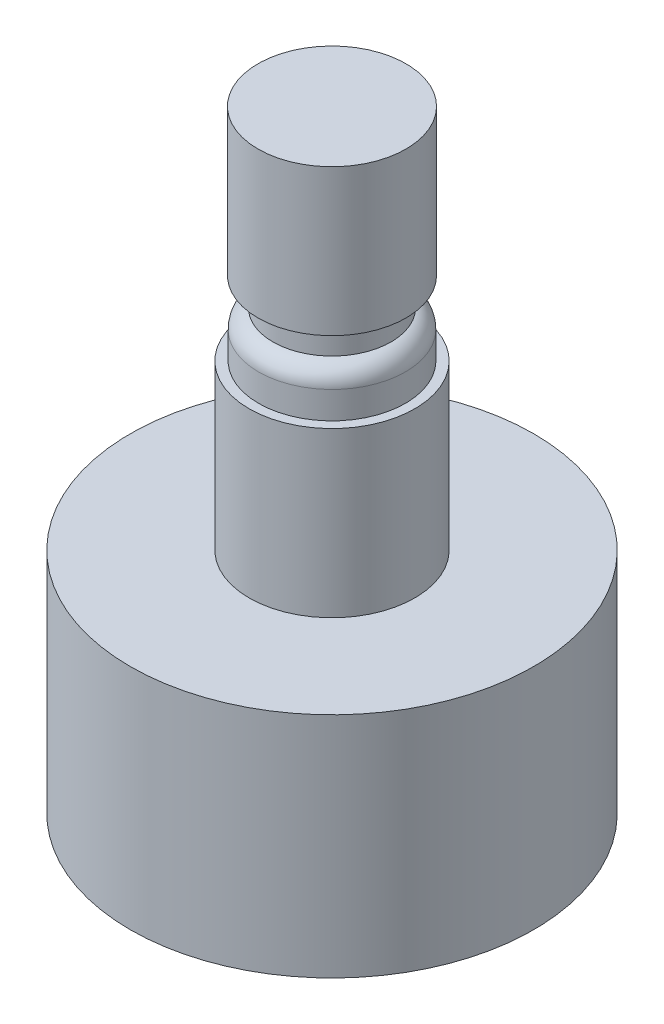
ISO-10303-21;
HEADER;
FILE_DESCRIPTION(('STEP AP214'),'2;1');
FILE_NAME('part.step','',(''),(''),'','','');
FILE_SCHEMA(('AUTOMOTIVE_DESIGN { 1 0 10303 214 1 1 1 1 }'));
ENDSEC;
DATA;
#1=APPLICATION_CONTEXT('core data for automotive mechanical design processes');
#2=APPLICATION_PROTOCOL_DEFINITION('international standard','automotive_design',2000,#1);
#3=PRODUCT_CONTEXT('',#1,'mechanical');
#4=PRODUCT('Part','Part','',(#3));
#5=PRODUCT_RELATED_PRODUCT_CATEGORY('part','',(#4));
#6=PRODUCT_DEFINITION_FORMATION('','',#4);
#7=PRODUCT_DEFINITION_CONTEXT('part definition',#1,'design');
#8=PRODUCT_DEFINITION('design','',#6,#7);
#9=PRODUCT_DEFINITION_SHAPE('','',#8);
#10=(LENGTH_UNIT() NAMED_UNIT(*) SI_UNIT(.MILLI.,.METRE.));
#11=(NAMED_UNIT(*) PLANE_ANGLE_UNIT() SI_UNIT($,.RADIAN.));
#12=(NAMED_UNIT(*) SI_UNIT($,.STERADIAN.) SOLID_ANGLE_UNIT());
#13=UNCERTAINTY_MEASURE_WITH_UNIT(LENGTH_MEASURE(1.E-05),#10,'distance_accuracy_value','');
#14=(GEOMETRIC_REPRESENTATION_CONTEXT(3) GLOBAL_UNCERTAINTY_ASSIGNED_CONTEXT((#13)) GLOBAL_UNIT_ASSIGNED_CONTEXT((#10,
#11,#12)) REPRESENTATION_CONTEXT('',''));
#15=CARTESIAN_POINT('',(0.,0.,0.));
#16=DIRECTION('',(0.,0.,1.));
#17=DIRECTION('',(1.,0.,0.));
#18=AXIS2_PLACEMENT_3D('',#15,#16,#17);
#19=CARTESIAN_POINT('',(0.,15.9131,0.));
#20=DIRECTION('',(0.,1.,0.));
#21=DIRECTION('',(0.,0.,1.));
#22=AXIS2_PLACEMENT_3D('',#19,#20,#21);
#23=PLANE('',#22);
#24=CARTESIAN_POINT('',(0.,15.9131,0.));
#25=DIRECTION('',(0.,1.,0.));
#26=DIRECTION('',(0.,0.,1.));
#27=AXIS2_PLACEMENT_3D('',#24,#25,#26);
#28=CIRCLE('',#27,3.3655);
#29=CARTESIAN_POINT('',(0.,15.9131,3.3655));
#30=VERTEX_POINT('',#29);
#31=EDGE_CURVE('E50',#30,#30,#28,.T.);
#32=ORIENTED_EDGE('',*,*,#31,.T.);
#33=EDGE_LOOP('',(#32));
#34=FACE_BOUND('',#33,.T.);
#35=CARTESIAN_POINT('',(0.,15.9131,0.));
#36=DIRECTION('',(0.,1.,0.));
#37=DIRECTION('',(0.,0.,1.));
#38=AXIS2_PLACEMENT_3D('',#35,#36,#37);
#39=CIRCLE('',#38,2.9845);
#40=CARTESIAN_POINT('',(0.,15.9131,2.9845));
#41=VERTEX_POINT('',#40);
#42=EDGE_CURVE('E55',#41,#41,#39,.T.);
#43=ORIENTED_EDGE('',*,*,#42,.F.);
#44=EDGE_LOOP('',(#43));
#45=FACE_BOUND('',#44,.T.);
#46=ADVANCED_FACE('F31',(#34,#45),#23,.T.);
#47=CARTESIAN_POINT('',(0.,9.2583,0.));
#48=DIRECTION('',(0.,1.,0.));
#49=DIRECTION('',(0.,0.,1.));
#50=AXIS2_PLACEMENT_3D('',#47,#48,#49);
#51=PLANE('',#50);
#52=CARTESIAN_POINT('',(0.,9.2583,0.));
#53=DIRECTION('',(0.,1.,0.));
#54=DIRECTION('',(0.,0.,1.));
#55=AXIS2_PLACEMENT_3D('',#52,#53,#54);
#56=CIRCLE('',#55,8.1915);
#57=CARTESIAN_POINT('',(0.,9.2583,8.1915));
#58=VERTEX_POINT('',#57);
#59=EDGE_CURVE('E42',#58,#58,#56,.T.);
#60=ORIENTED_EDGE('',*,*,#59,.T.);
#61=EDGE_LOOP('',(#60));
#62=FACE_BOUND('',#61,.T.);
#63=CARTESIAN_POINT('',(0.,9.2583,0.));
#64=DIRECTION('',(0.,1.,0.));
#65=DIRECTION('',(0.,0.,1.));
#66=AXIS2_PLACEMENT_3D('',#63,#64,#65);
#67=CIRCLE('',#66,3.3655);
#68=CARTESIAN_POINT('',(0.,9.2583,3.3655));
#69=VERTEX_POINT('',#68);
#70=EDGE_CURVE('E52',#69,#69,#67,.T.);
#71=ORIENTED_EDGE('',*,*,#70,.F.);
#72=EDGE_LOOP('',(#71));
#73=FACE_BOUND('',#72,.T.);
#74=ADVANCED_FACE('F99',(#62,#73),#51,.T.);
#75=CARTESIAN_POINT('',(0.,9.2583,0.));
#76=DIRECTION('',(0.,-1.,0.));
#77=DIRECTION('',(0.,0.,-1.));
#78=AXIS2_PLACEMENT_3D('',#75,#76,#77);
#79=CYLINDRICAL_SURFACE('',#78,8.1915);
#80=ORIENTED_EDGE('',*,*,#59,.F.);
#81=EDGE_LOOP('',(#80));
#82=FACE_BOUND('',#81,.T.);
#83=CARTESIAN_POINT('',(0.,0.,0.));
#84=DIRECTION('',(0.,1.,0.));
#85=DIRECTION('',(0.,0.,1.));
#86=AXIS2_PLACEMENT_3D('',#83,#84,#85);
#87=CIRCLE('',#86,8.1915);
#88=CARTESIAN_POINT('',(0.,0.,8.1915));
#89=VERTEX_POINT('',#88);
#90=EDGE_CURVE('E46',#89,#89,#87,.T.);
#91=ORIENTED_EDGE('',*,*,#90,.T.);
#92=EDGE_LOOP('',(#91));
#93=FACE_BOUND('',#92,.T.);
#94=ADVANCED_FACE('F105',(#82,#93),#79,.T.);
#95=CARTESIAN_POINT('',(0.,0.,0.));
#96=DIRECTION('',(0.,1.,0.));
#97=DIRECTION('',(0.,0.,1.));
#98=AXIS2_PLACEMENT_3D('',#95,#96,#97);
#99=PLANE('',#98);
#100=ORIENTED_EDGE('',*,*,#90,.F.);
#101=EDGE_LOOP('',(#100));
#102=FACE_BOUND('',#101,.T.);
#103=ADVANCED_FACE('F114',(#102),#99,.F.);
#104=CARTESIAN_POINT('',(0.,15.9131,0.));
#105=DIRECTION('',(0.,-1.,0.));
#106=DIRECTION('',(0.,0.,-1.));
#107=AXIS2_PLACEMENT_3D('',#104,#105,#106);
#108=CYLINDRICAL_SURFACE('',#107,3.3655);
#109=ORIENTED_EDGE('',*,*,#31,.F.);
#110=EDGE_LOOP('',(#109));
#111=FACE_BOUND('',#110,.T.);
#112=ORIENTED_EDGE('',*,*,#70,.T.);
#113=EDGE_LOOP('',(#112));
#114=FACE_BOUND('',#113,.T.);
#115=ADVANCED_FACE('F112',(#111,#114),#108,.T.);
#116=CARTESIAN_POINT('',(0.,17.78,0.));
#117=DIRECTION('',(0.,-1.,0.));
#118=DIRECTION('',(0.,0.,-1.));
#119=AXIS2_PLACEMENT_3D('',#116,#117,#118);
#120=CYLINDRICAL_SURFACE('',#119,2.9845);
#121=CARTESIAN_POINT('',(0.,17.018,0.));
#122=DIRECTION('',(0.,1.,0.));
#123=DIRECTION('',(0.,0.,1.));
#124=AXIS2_PLACEMENT_3D('',#121,#122,#123);
#125=CIRCLE('',#124,2.9845);
#126=CARTESIAN_POINT('',(0.,17.018,2.9845));
#127=VERTEX_POINT('',#126);
#128=EDGE_CURVE('E10',#127,#127,#125,.F.);
#129=ORIENTED_EDGE('',*,*,#128,.T.);
#130=EDGE_LOOP('',(#129));
#131=FACE_BOUND('',#130,.T.);
#132=ORIENTED_EDGE('',*,*,#42,.T.);
#133=EDGE_LOOP('',(#132));
#134=FACE_BOUND('',#133,.T.);
#135=ADVANCED_FACE('F111',(#131,#134),#120,.T.);
#136=CARTESIAN_POINT('',(0.,17.018,0.));
#137=DIRECTION('',(0.,1.,0.));
#138=DIRECTION('',(0.,0.,1.));
#139=AXIS2_PLACEMENT_3D('',#136,#137,#138);
#140=TOROIDAL_SURFACE('',#139,2.2225,0.762);
#141=ORIENTED_EDGE('',*,*,#128,.F.);
#142=EDGE_LOOP('',(#141));
#143=FACE_BOUND('',#142,.T.);
#144=CARTESIAN_POINT('',(0.,17.78,0.));
#145=DIRECTION('',(0.,1.,0.));
#146=DIRECTION('',(0.,0.,1.));
#147=AXIS2_PLACEMENT_3D('',#144,#145,#146);
#148=CIRCLE('',#147,2.2225);
#149=CARTESIAN_POINT('',(0.,17.78,2.2225));
#150=VERTEX_POINT('',#149);
#151=EDGE_CURVE('E38',#150,#150,#148,.T.);
#152=ORIENTED_EDGE('',*,*,#151,.F.);
#153=EDGE_LOOP('',(#152));
#154=FACE_BOUND('',#153,.T.);
#155=ADVANCED_FACE('F33',(#143,#154),#140,.T.);
#156=CARTESIAN_POINT('',(0.,18.923,0.));
#157=DIRECTION('',(0.,-1.,0.));
#158=DIRECTION('',(0.,0.,-1.));
#159=AXIS2_PLACEMENT_3D('',#156,#157,#158);
#160=CYLINDRICAL_SURFACE('',#159,2.4003);
#161=CARTESIAN_POINT('',(0.,18.923,0.));
#162=DIRECTION('',(0.,1.,0.));
#163=DIRECTION('',(0.,0.,1.));
#164=AXIS2_PLACEMENT_3D('',#161,#162,#163);
#165=CIRCLE('',#164,2.4003);
#166=CARTESIAN_POINT('',(0.,18.923,2.4003));
#167=VERTEX_POINT('',#166);
#168=EDGE_CURVE('E60',#167,#167,#165,.T.);
#169=ORIENTED_EDGE('',*,*,#168,.F.);
#170=EDGE_LOOP('',(#169));
#171=FACE_BOUND('',#170,.T.);
#172=CARTESIAN_POINT('',(0.,17.78,0.));
#173=DIRECTION('',(0.,1.,0.));
#174=DIRECTION('',(0.,0.,1.));
#175=AXIS2_PLACEMENT_3D('',#172,#173,#174);
#176=CIRCLE('',#175,2.4003);
#177=CARTESIAN_POINT('',(0.,17.78,2.4003));
#178=VERTEX_POINT('',#177);
#179=EDGE_CURVE('E61',#178,#178,#176,.T.);
#180=ORIENTED_EDGE('',*,*,#179,.T.);
#181=EDGE_LOOP('',(#180));
#182=FACE_BOUND('',#181,.T.);
#183=ADVANCED_FACE('F88',(#171,#182),#160,.T.);
#184=CARTESIAN_POINT('',(0.,17.78,0.));
#185=DIRECTION('',(0.,1.,0.));
#186=DIRECTION('',(0.,0.,1.));
#187=AXIS2_PLACEMENT_3D('',#184,#185,#186);
#188=PLANE('',#187);
#189=ORIENTED_EDGE('',*,*,#151,.T.);
#190=EDGE_LOOP('',(#189));
#191=FACE_BOUND('',#190,.T.);
#192=ORIENTED_EDGE('',*,*,#179,.F.);
#193=EDGE_LOOP('',(#192));
#194=FACE_BOUND('',#193,.T.);
#195=ADVANCED_FACE('F84',(#191,#194),#188,.F.);
#196=CARTESIAN_POINT('',(0.,18.923,0.));
#197=DIRECTION('',(0.,1.,0.));
#198=DIRECTION('',(0.,0.,1.));
#199=AXIS2_PLACEMENT_3D('',#196,#197,#198);
#200=PLANE('',#199);
#201=CARTESIAN_POINT('',(0.,18.923,0.));
#202=DIRECTION('',(0.,1.,0.));
#203=DIRECTION('',(0.,0.,1.));
#204=AXIS2_PLACEMENT_3D('',#201,#202,#203);
#205=CIRCLE('',#204,3.00355);
#206=CARTESIAN_POINT('',(0.,18.923,3.00355));
#207=VERTEX_POINT('',#206);
#208=EDGE_CURVE('E67',#207,#207,#205,.T.);
#209=ORIENTED_EDGE('',*,*,#208,.F.);
#210=EDGE_LOOP('',(#209));
#211=FACE_BOUND('',#210,.T.);
#212=ORIENTED_EDGE('',*,*,#168,.T.);
#213=EDGE_LOOP('',(#212));
#214=FACE_BOUND('',#213,.T.);
#215=ADVANCED_FACE('F78',(#211,#214),#200,.F.);
#216=CARTESIAN_POINT('',(0.,24.8666,0.));
#217=DIRECTION('',(0.,-1.,0.));
#218=DIRECTION('',(0.,0.,-1.));
#219=AXIS2_PLACEMENT_3D('',#216,#217,#218);
#220=CYLINDRICAL_SURFACE('',#219,3.00355);
#221=CARTESIAN_POINT('',(0.,24.8666,0.));
#222=DIRECTION('',(0.,1.,0.));
#223=DIRECTION('',(0.,0.,1.));
#224=AXIS2_PLACEMENT_3D('',#221,#222,#223);
#225=CIRCLE('',#224,3.00355);
#226=CARTESIAN_POINT('',(0.,24.8666,3.00355));
#227=VERTEX_POINT('',#226);
#228=EDGE_CURVE('E64',#227,#227,#225,.T.);
#229=ORIENTED_EDGE('',*,*,#228,.F.);
#230=EDGE_LOOP('',(#229));
#231=FACE_BOUND('',#230,.T.);
#232=ORIENTED_EDGE('',*,*,#208,.T.);
#233=EDGE_LOOP('',(#232));
#234=FACE_BOUND('',#233,.T.);
#235=ADVANCED_FACE('F75',(#231,#234),#220,.T.);
#236=CARTESIAN_POINT('',(0.,24.8666,0.));
#237=DIRECTION('',(0.,1.,0.));
#238=DIRECTION('',(0.,0.,1.));
#239=AXIS2_PLACEMENT_3D('',#236,#237,#238);
#240=PLANE('',#239);
#241=ORIENTED_EDGE('',*,*,#228,.T.);
#242=EDGE_LOOP('',(#241));
#243=FACE_BOUND('',#242,.T.);
#244=ADVANCED_FACE('F73',(#243),#240,.T.);
#245=CLOSED_SHELL('',(#46,#74,#94,#103,#115,#135,#155,#183,#195,#215,#235,#244));
#246=MANIFOLD_SOLID_BREP('B2',#245);
#247=ADVANCED_BREP_SHAPE_REPRESENTATION('',(#18,#246),#14);
#248=SHAPE_DEFINITION_REPRESENTATION(#9,#247);
ENDSEC;
END-ISO-10303-21;
